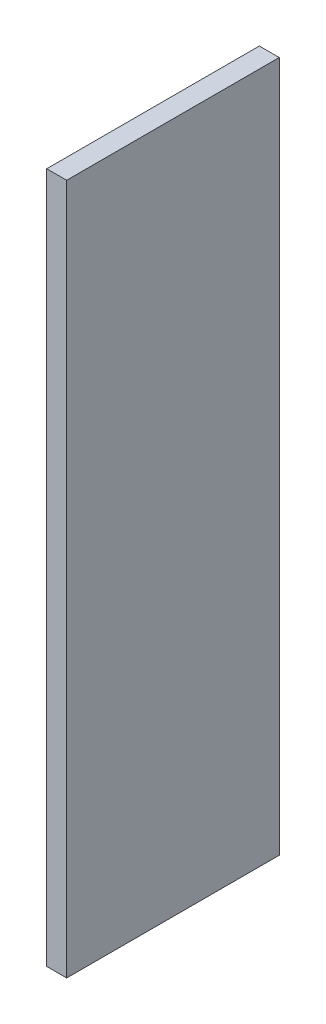
ISO-10303-21;
HEADER;
FILE_DESCRIPTION(('STEP AP214'),'2;1');
FILE_NAME('part.step','',(''),(''),'','','');
FILE_SCHEMA(('AUTOMOTIVE_DESIGN { 1 0 10303 214 1 1 1 1 }'));
ENDSEC;
DATA;
#1=APPLICATION_CONTEXT('core data for automotive mechanical design processes');
#2=APPLICATION_PROTOCOL_DEFINITION('international standard','automotive_design',2000,#1);
#3=PRODUCT_CONTEXT('',#1,'mechanical');
#4=PRODUCT('Part','Part','',(#3));
#5=PRODUCT_RELATED_PRODUCT_CATEGORY('part','',(#4));
#6=PRODUCT_DEFINITION_FORMATION('','',#4);
#7=PRODUCT_DEFINITION_CONTEXT('part definition',#1,'design');
#8=PRODUCT_DEFINITION('design','',#6,#7);
#9=PRODUCT_DEFINITION_SHAPE('','',#8);
#10=(LENGTH_UNIT() NAMED_UNIT(*) SI_UNIT(.MILLI.,.METRE.));
#11=(NAMED_UNIT(*) PLANE_ANGLE_UNIT() SI_UNIT($,.RADIAN.));
#12=(NAMED_UNIT(*) SI_UNIT($,.STERADIAN.) SOLID_ANGLE_UNIT());
#13=UNCERTAINTY_MEASURE_WITH_UNIT(LENGTH_MEASURE(1.E-05),#10,'distance_accuracy_value','');
#14=(GEOMETRIC_REPRESENTATION_CONTEXT(3) GLOBAL_UNCERTAINTY_ASSIGNED_CONTEXT((#13)) GLOBAL_UNIT_ASSIGNED_CONTEXT((#10,
#11,#12)) REPRESENTATION_CONTEXT('',''));
#15=CARTESIAN_POINT('',(0.,0.,0.));
#16=DIRECTION('',(0.,0.,1.));
#17=DIRECTION('',(1.,0.,0.));
#18=AXIS2_PLACEMENT_3D('',#15,#16,#17);
#19=CARTESIAN_POINT('',(19.05,-47.9803875482156,30.4666339184487));
#20=DIRECTION('',(0.,1.,0.));
#21=DIRECTION('',(0.,0.,1.));
#22=AXIS2_PLACEMENT_3D('',#19,#20,#21);
#23=PLANE('',#22);
#24=DIRECTION('',(0.,0.,-1.));
#25=VECTOR('',#24,1.);
#26=CARTESIAN_POINT('',(0.,-47.9803875482156,30.4666339184487));
#27=LINE('',#26,#25);
#28=CARTESIAN_POINT('',(0.,-47.9803875482156,30.4666339184487));
#29=VERTEX_POINT('',#28);
#30=CARTESIAN_POINT('',(0.,-47.9803875482156,-172.733366081551));
#31=VERTEX_POINT('',#30);
#32=EDGE_CURVE('E106',#29,#31,#27,.T.);
#33=ORIENTED_EDGE('',*,*,#32,.T.);
#34=DIRECTION('',(-1.,0.,0.));
#35=VECTOR('',#34,1.);
#36=CARTESIAN_POINT('',(19.05,-47.9803875482156,-172.733366081551));
#37=LINE('',#36,#35);
#38=CARTESIAN_POINT('',(19.05,-47.9803875482156,-172.733366081551));
#39=VERTEX_POINT('',#38);
#40=EDGE_CURVE('E11',#39,#31,#37,.T.);
#41=ORIENTED_EDGE('',*,*,#40,.F.);
#42=DIRECTION('',(0.,0.,-1.));
#43=VECTOR('',#42,1.);
#44=CARTESIAN_POINT('',(19.05,-47.9803875482156,30.4666339184487));
#45=LINE('',#44,#43);
#46=CARTESIAN_POINT('',(19.05,-47.9803875482156,30.4666339184487));
#47=VERTEX_POINT('',#46);
#48=EDGE_CURVE('E79',#47,#39,#45,.T.);
#49=ORIENTED_EDGE('',*,*,#48,.F.);
#50=DIRECTION('',(-1.,0.,0.));
#51=VECTOR('',#50,1.);
#52=CARTESIAN_POINT('',(19.05,-47.9803875482156,30.4666339184487));
#53=LINE('',#52,#51);
#54=EDGE_CURVE('E102',#47,#29,#53,.T.);
#55=ORIENTED_EDGE('',*,*,#54,.T.);
#56=EDGE_LOOP('',(#33,#41,#49,#55));
#57=FACE_BOUND('',#56,.T.);
#58=ADVANCED_FACE('F39',(#57),#23,.F.);
#59=CARTESIAN_POINT('',(19.05,612.419612451784,-172.733366081551));
#60=DIRECTION('',(0.,0.,-1.));
#61=DIRECTION('',(0.,1.,0.));
#62=AXIS2_PLACEMENT_3D('',#59,#60,#61);
#63=PLANE('',#62);
#64=DIRECTION('',(0.,-1.,0.));
#65=VECTOR('',#64,1.);
#66=CARTESIAN_POINT('',(0.,612.419612451784,-172.733366081551));
#67=LINE('',#66,#65);
#68=CARTESIAN_POINT('',(0.,612.419612451784,-172.733366081551));
#69=VERTEX_POINT('',#68);
#70=EDGE_CURVE('E88',#69,#31,#67,.T.);
#71=ORIENTED_EDGE('',*,*,#70,.F.);
#72=DIRECTION('',(-1.,0.,0.));
#73=VECTOR('',#72,1.);
#74=CARTESIAN_POINT('',(19.05,612.419612451784,-172.733366081551));
#75=LINE('',#74,#73);
#76=CARTESIAN_POINT('',(19.05,612.419612451784,-172.733366081551));
#77=VERTEX_POINT('',#76);
#78=EDGE_CURVE('E48',#77,#69,#75,.T.);
#79=ORIENTED_EDGE('',*,*,#78,.F.);
#80=DIRECTION('',(0.,-1.,0.));
#81=VECTOR('',#80,1.);
#82=CARTESIAN_POINT('',(19.05,612.419612451784,-172.733366081551));
#83=LINE('',#82,#81);
#84=EDGE_CURVE('E86',#77,#39,#83,.T.);
#85=ORIENTED_EDGE('',*,*,#84,.T.);
#86=ORIENTED_EDGE('',*,*,#40,.T.);
#87=EDGE_LOOP('',(#71,#79,#85,#86));
#88=FACE_BOUND('',#87,.T.);
#89=ADVANCED_FACE('F85',(#88),#63,.T.);
#90=CARTESIAN_POINT('',(19.05,612.419612451784,30.4666339184487));
#91=DIRECTION('',(0.,1.,0.));
#92=DIRECTION('',(0.,0.,1.));
#93=AXIS2_PLACEMENT_3D('',#90,#91,#92);
#94=PLANE('',#93);
#95=DIRECTION('',(0.,0.,-1.));
#96=VECTOR('',#95,1.);
#97=CARTESIAN_POINT('',(0.,612.419612451784,30.4666339184487));
#98=LINE('',#97,#96);
#99=CARTESIAN_POINT('',(0.,612.419612451784,30.4666339184487));
#100=VERTEX_POINT('',#99);
#101=EDGE_CURVE('E112',#100,#69,#98,.T.);
#102=ORIENTED_EDGE('',*,*,#101,.F.);
#103=DIRECTION('',(-1.,0.,0.));
#104=VECTOR('',#103,1.);
#105=CARTESIAN_POINT('',(19.05,612.419612451784,30.4666339184487));
#106=LINE('',#105,#104);
#107=CARTESIAN_POINT('',(19.05,612.419612451784,30.4666339184487));
#108=VERTEX_POINT('',#107);
#109=EDGE_CURVE('E71',#108,#100,#106,.T.);
#110=ORIENTED_EDGE('',*,*,#109,.F.);
#111=DIRECTION('',(0.,0.,-1.));
#112=VECTOR('',#111,1.);
#113=CARTESIAN_POINT('',(19.05,612.419612451784,30.4666339184487));
#114=LINE('',#113,#112);
#115=EDGE_CURVE('E95',#108,#77,#114,.T.);
#116=ORIENTED_EDGE('',*,*,#115,.T.);
#117=ORIENTED_EDGE('',*,*,#78,.T.);
#118=EDGE_LOOP('',(#102,#110,#116,#117));
#119=FACE_BOUND('',#118,.T.);
#120=ADVANCED_FACE('F98',(#119),#94,.T.);
#121=CARTESIAN_POINT('',(19.05,612.419612451784,30.4666339184487));
#122=DIRECTION('',(0.,0.,-1.));
#123=DIRECTION('',(0.,1.,0.));
#124=AXIS2_PLACEMENT_3D('',#121,#122,#123);
#125=PLANE('',#124);
#126=DIRECTION('',(0.,-1.,0.));
#127=VECTOR('',#126,1.);
#128=CARTESIAN_POINT('',(0.,612.419612451784,30.4666339184487));
#129=LINE('',#128,#127);
#130=EDGE_CURVE('E74',#100,#29,#129,.T.);
#131=ORIENTED_EDGE('',*,*,#130,.T.);
#132=ORIENTED_EDGE('',*,*,#54,.F.);
#133=DIRECTION('',(0.,-1.,0.));
#134=VECTOR('',#133,1.);
#135=CARTESIAN_POINT('',(19.05,612.419612451784,30.4666339184487));
#136=LINE('',#135,#134);
#137=EDGE_CURVE('E56',#108,#47,#136,.T.);
#138=ORIENTED_EDGE('',*,*,#137,.F.);
#139=ORIENTED_EDGE('',*,*,#109,.T.);
#140=EDGE_LOOP('',(#131,#132,#138,#139));
#141=FACE_BOUND('',#140,.T.);
#142=ADVANCED_FACE('F129',(#141),#125,.F.);
#143=CARTESIAN_POINT('',(19.05,0.,0.));
#144=DIRECTION('',(-1.,0.,0.));
#145=DIRECTION('',(0.,0.,1.));
#146=AXIS2_PLACEMENT_3D('',#143,#144,#145);
#147=PLANE('',#146);
#148=ORIENTED_EDGE('',*,*,#48,.T.);
#149=ORIENTED_EDGE('',*,*,#84,.F.);
#150=ORIENTED_EDGE('',*,*,#115,.F.);
#151=ORIENTED_EDGE('',*,*,#137,.T.);
#152=EDGE_LOOP('',(#148,#149,#150,#151));
#153=FACE_BOUND('',#152,.T.);
#154=ADVANCED_FACE('F94',(#153),#147,.F.);
#155=CARTESIAN_POINT('',(0.,0.,0.));
#156=DIRECTION('',(-1.,0.,0.));
#157=DIRECTION('',(0.,0.,1.));
#158=AXIS2_PLACEMENT_3D('',#155,#156,#157);
#159=PLANE('',#158);
#160=ORIENTED_EDGE('',*,*,#32,.F.);
#161=ORIENTED_EDGE('',*,*,#130,.F.);
#162=ORIENTED_EDGE('',*,*,#101,.T.);
#163=ORIENTED_EDGE('',*,*,#70,.T.);
#164=EDGE_LOOP('',(#160,#161,#162,#163));
#165=FACE_BOUND('',#164,.T.);
#166=ADVANCED_FACE('F123',(#165),#159,.T.);
#167=CLOSED_SHELL('',(#58,#89,#120,#142,#154,#166));
#168=MANIFOLD_SOLID_BREP('B2',#167);
#169=ADVANCED_BREP_SHAPE_REPRESENTATION('',(#18,#168),#14);
#170=SHAPE_DEFINITION_REPRESENTATION(#9,#169);
ENDSEC;
END-ISO-10303-21;
